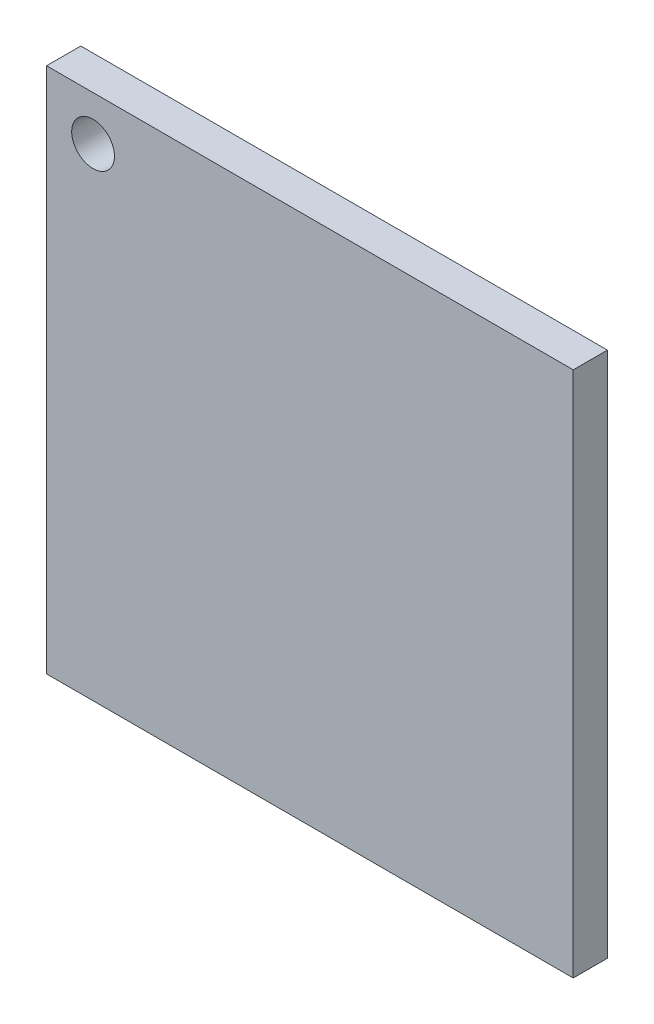
ISO-10303-21;
HEADER;
FILE_DESCRIPTION(('STEP AP214'),'2;1');
FILE_NAME('part.step','',(''),(''),'','','');
FILE_SCHEMA(('AUTOMOTIVE_DESIGN { 1 0 10303 214 1 1 1 1 }'));
ENDSEC;
DATA;
#1=APPLICATION_CONTEXT('core data for automotive mechanical design processes');
#2=APPLICATION_PROTOCOL_DEFINITION('international standard','automotive_design',2000,#1);
#3=PRODUCT_CONTEXT('',#1,'mechanical');
#4=PRODUCT('Part','Part','',(#3));
#5=PRODUCT_RELATED_PRODUCT_CATEGORY('part','',(#4));
#6=PRODUCT_DEFINITION_FORMATION('','',#4);
#7=PRODUCT_DEFINITION_CONTEXT('part definition',#1,'design');
#8=PRODUCT_DEFINITION('design','',#6,#7);
#9=PRODUCT_DEFINITION_SHAPE('','',#8);
#10=(LENGTH_UNIT() NAMED_UNIT(*) SI_UNIT(.MILLI.,.METRE.));
#11=(NAMED_UNIT(*) PLANE_ANGLE_UNIT() SI_UNIT($,.RADIAN.));
#12=(NAMED_UNIT(*) SI_UNIT($,.STERADIAN.) SOLID_ANGLE_UNIT());
#13=UNCERTAINTY_MEASURE_WITH_UNIT(LENGTH_MEASURE(1.E-05),#10,'distance_accuracy_value','');
#14=(GEOMETRIC_REPRESENTATION_CONTEXT(3) GLOBAL_UNCERTAINTY_ASSIGNED_CONTEXT((#13)) GLOBAL_UNIT_ASSIGNED_CONTEXT((#10,
#11,#12)) REPRESENTATION_CONTEXT('',''));
#15=CARTESIAN_POINT('',(0.,0.,0.));
#16=DIRECTION('',(0.,0.,1.));
#17=DIRECTION('',(1.,0.,0.));
#18=AXIS2_PLACEMENT_3D('',#15,#16,#17);
#19=CARTESIAN_POINT('',(0.,0.,10.));
#20=DIRECTION('',(0.,0.,1.));
#21=DIRECTION('',(1.,0.,0.));
#22=AXIS2_PLACEMENT_3D('',#19,#20,#21);
#23=PLANE('',#22);
#24=DIRECTION('',(0.,-1.,0.));
#25=VECTOR('',#24,1.);
#26=CARTESIAN_POINT('',(0.,0.,10.));
#27=LINE('',#26,#25);
#28=CARTESIAN_POINT('',(0.,0.,10.));
#29=VERTEX_POINT('',#28);
#30=CARTESIAN_POINT('',(0.,-154.,10.));
#31=VERTEX_POINT('',#30);
#32=EDGE_CURVE('E111',#29,#31,#27,.T.);
#33=ORIENTED_EDGE('',*,*,#32,.T.);
#34=DIRECTION('',(1.,0.,0.));
#35=VECTOR('',#34,1.);
#36=CARTESIAN_POINT('',(0.,-154.,10.));
#37=LINE('',#36,#35);
#38=CARTESIAN_POINT('',(154.,-154.,10.));
#39=VERTEX_POINT('',#38);
#40=EDGE_CURVE('E103',#31,#39,#37,.T.);
#41=ORIENTED_EDGE('',*,*,#40,.T.);
#42=DIRECTION('',(0.,-1.,0.));
#43=VECTOR('',#42,1.);
#44=CARTESIAN_POINT('',(154.,0.,10.));
#45=LINE('',#44,#43);
#46=CARTESIAN_POINT('',(154.,0.,10.));
#47=VERTEX_POINT('',#46);
#48=EDGE_CURVE('E110',#47,#39,#45,.T.);
#49=ORIENTED_EDGE('',*,*,#48,.F.);
#50=DIRECTION('',(1.,0.,0.));
#51=VECTOR('',#50,1.);
#52=CARTESIAN_POINT('',(0.,0.,10.));
#53=LINE('',#52,#51);
#54=EDGE_CURVE('E123',#29,#47,#53,.T.);
#55=ORIENTED_EDGE('',*,*,#54,.F.);
#56=EDGE_LOOP('',(#33,#41,#49,#55));
#57=FACE_BOUND('',#56,.T.);
#58=CARTESIAN_POINT('',(13.6,-13.,10.));
#59=DIRECTION('',(0.,0.,1.));
#60=DIRECTION('',(1.,0.,0.));
#61=AXIS2_PLACEMENT_3D('',#58,#59,#60);
#62=CIRCLE('',#61,6.25);
#63=CARTESIAN_POINT('',(19.85,-13.,10.));
#64=VERTEX_POINT('',#63);
#65=EDGE_CURVE('E132',#64,#64,#62,.T.);
#66=ORIENTED_EDGE('',*,*,#65,.F.);
#67=EDGE_LOOP('',(#66));
#68=FACE_BOUND('',#67,.T.);
#69=ADVANCED_FACE('F60',(#57,#68),#23,.T.);
#70=CARTESIAN_POINT('',(0.,0.,0.));
#71=DIRECTION('',(0.,0.,1.));
#72=DIRECTION('',(1.,0.,0.));
#73=AXIS2_PLACEMENT_3D('',#70,#71,#72);
#74=PLANE('',#73);
#75=DIRECTION('',(0.,-1.,0.));
#76=VECTOR('',#75,1.);
#77=CARTESIAN_POINT('',(0.,0.,0.));
#78=LINE('',#77,#76);
#79=CARTESIAN_POINT('',(0.,0.,0.));
#80=VERTEX_POINT('',#79);
#81=CARTESIAN_POINT('',(0.,-154.,0.));
#82=VERTEX_POINT('',#81);
#83=EDGE_CURVE('E129',#80,#82,#78,.T.);
#84=ORIENTED_EDGE('',*,*,#83,.F.);
#85=DIRECTION('',(1.,0.,0.));
#86=VECTOR('',#85,1.);
#87=CARTESIAN_POINT('',(0.,0.,0.));
#88=LINE('',#87,#86);
#89=CARTESIAN_POINT('',(154.,0.,0.));
#90=VERTEX_POINT('',#89);
#91=EDGE_CURVE('E138',#80,#90,#88,.T.);
#92=ORIENTED_EDGE('',*,*,#91,.T.);
#93=DIRECTION('',(0.,-1.,0.));
#94=VECTOR('',#93,1.);
#95=CARTESIAN_POINT('',(154.,0.,0.));
#96=LINE('',#95,#94);
#97=CARTESIAN_POINT('',(154.,-154.,0.));
#98=VERTEX_POINT('',#97);
#99=EDGE_CURVE('E135',#90,#98,#96,.T.);
#100=ORIENTED_EDGE('',*,*,#99,.T.);
#101=DIRECTION('',(1.,0.,0.));
#102=VECTOR('',#101,1.);
#103=CARTESIAN_POINT('',(0.,-154.,0.));
#104=LINE('',#103,#102);
#105=EDGE_CURVE('E117',#82,#98,#104,.T.);
#106=ORIENTED_EDGE('',*,*,#105,.F.);
#107=EDGE_LOOP('',(#84,#92,#100,#106));
#108=FACE_BOUND('',#107,.T.);
#109=CARTESIAN_POINT('',(13.6,-13.,0.));
#110=DIRECTION('',(0.,0.,1.));
#111=DIRECTION('',(1.,0.,0.));
#112=AXIS2_PLACEMENT_3D('',#109,#110,#111);
#113=CIRCLE('',#112,6.25);
#114=CARTESIAN_POINT('',(19.85,-13.,0.));
#115=VERTEX_POINT('',#114);
#116=EDGE_CURVE('E148',#115,#115,#113,.T.);
#117=ORIENTED_EDGE('',*,*,#116,.T.);
#118=EDGE_LOOP('',(#117));
#119=FACE_BOUND('',#118,.T.);
#120=ADVANCED_FACE('F159',(#108,#119),#74,.F.);
#121=CARTESIAN_POINT('',(0.,0.,10.));
#122=DIRECTION('',(1.,0.,0.));
#123=DIRECTION('',(0.,1.,0.));
#124=AXIS2_PLACEMENT_3D('',#121,#122,#123);
#125=PLANE('',#124);
#126=ORIENTED_EDGE('',*,*,#83,.T.);
#127=DIRECTION('',(0.,0.,-1.));
#128=VECTOR('',#127,1.);
#129=CARTESIAN_POINT('',(0.,-154.,10.));
#130=LINE('',#129,#128);
#131=EDGE_CURVE('E12',#31,#82,#130,.T.);
#132=ORIENTED_EDGE('',*,*,#131,.F.);
#133=ORIENTED_EDGE('',*,*,#32,.F.);
#134=DIRECTION('',(0.,0.,-1.));
#135=VECTOR('',#134,1.);
#136=CARTESIAN_POINT('',(0.,0.,10.));
#137=LINE('',#136,#135);
#138=EDGE_CURVE('E78',#29,#80,#137,.T.);
#139=ORIENTED_EDGE('',*,*,#138,.T.);
#140=EDGE_LOOP('',(#126,#132,#133,#139));
#141=FACE_BOUND('',#140,.T.);
#142=ADVANCED_FACE('F62',(#141),#125,.F.);
#143=CARTESIAN_POINT('',(0.,-154.,10.));
#144=DIRECTION('',(0.,1.,0.));
#145=DIRECTION('',(0.,0.,1.));
#146=AXIS2_PLACEMENT_3D('',#143,#144,#145);
#147=PLANE('',#146);
#148=ORIENTED_EDGE('',*,*,#105,.T.);
#149=DIRECTION('',(0.,0.,-1.));
#150=VECTOR('',#149,1.);
#151=CARTESIAN_POINT('',(154.,-154.,10.));
#152=LINE('',#151,#150);
#153=EDGE_CURVE('E70',#39,#98,#152,.T.);
#154=ORIENTED_EDGE('',*,*,#153,.F.);
#155=ORIENTED_EDGE('',*,*,#40,.F.);
#156=ORIENTED_EDGE('',*,*,#131,.T.);
#157=EDGE_LOOP('',(#148,#154,#155,#156));
#158=FACE_BOUND('',#157,.T.);
#159=ADVANCED_FACE('F116',(#158),#147,.F.);
#160=CARTESIAN_POINT('',(154.,0.,10.));
#161=DIRECTION('',(1.,0.,0.));
#162=DIRECTION('',(0.,1.,0.));
#163=AXIS2_PLACEMENT_3D('',#160,#161,#162);
#164=PLANE('',#163);
#165=ORIENTED_EDGE('',*,*,#99,.F.);
#166=DIRECTION('',(0.,0.,-1.));
#167=VECTOR('',#166,1.);
#168=CARTESIAN_POINT('',(154.,0.,10.));
#169=LINE('',#168,#167);
#170=EDGE_CURVE('E92',#47,#90,#169,.T.);
#171=ORIENTED_EDGE('',*,*,#170,.F.);
#172=ORIENTED_EDGE('',*,*,#48,.T.);
#173=ORIENTED_EDGE('',*,*,#153,.T.);
#174=EDGE_LOOP('',(#165,#171,#172,#173));
#175=FACE_BOUND('',#174,.T.);
#176=ADVANCED_FACE('F121',(#175),#164,.T.);
#177=CARTESIAN_POINT('',(0.,0.,10.));
#178=DIRECTION('',(0.,1.,0.));
#179=DIRECTION('',(0.,0.,1.));
#180=AXIS2_PLACEMENT_3D('',#177,#178,#179);
#181=PLANE('',#180);
#182=ORIENTED_EDGE('',*,*,#91,.F.);
#183=ORIENTED_EDGE('',*,*,#138,.F.);
#184=ORIENTED_EDGE('',*,*,#54,.T.);
#185=ORIENTED_EDGE('',*,*,#170,.T.);
#186=EDGE_LOOP('',(#182,#183,#184,#185));
#187=FACE_BOUND('',#186,.T.);
#188=ADVANCED_FACE('F167',(#187),#181,.T.);
#189=CARTESIAN_POINT('',(13.6,-13.,10.));
#190=DIRECTION('',(0.,0.,-1.));
#191=DIRECTION('',(-1.,0.,0.));
#192=AXIS2_PLACEMENT_3D('',#189,#190,#191);
#193=CYLINDRICAL_SURFACE('',#192,6.25);
#194=ORIENTED_EDGE('',*,*,#65,.T.);
#195=EDGE_LOOP('',(#194));
#196=FACE_BOUND('',#195,.T.);
#197=ORIENTED_EDGE('',*,*,#116,.F.);
#198=EDGE_LOOP('',(#197));
#199=FACE_BOUND('',#198,.T.);
#200=ADVANCED_FACE('F156',(#196,#199),#193,.F.);
#201=CLOSED_SHELL('',(#69,#120,#142,#159,#176,#188,#200));
#202=MANIFOLD_SOLID_BREP('B2',#201);
#203=ADVANCED_BREP_SHAPE_REPRESENTATION('',(#18,#202),#14);
#204=SHAPE_DEFINITION_REPRESENTATION(#9,#203);
ENDSEC;
END-ISO-10303-21;
